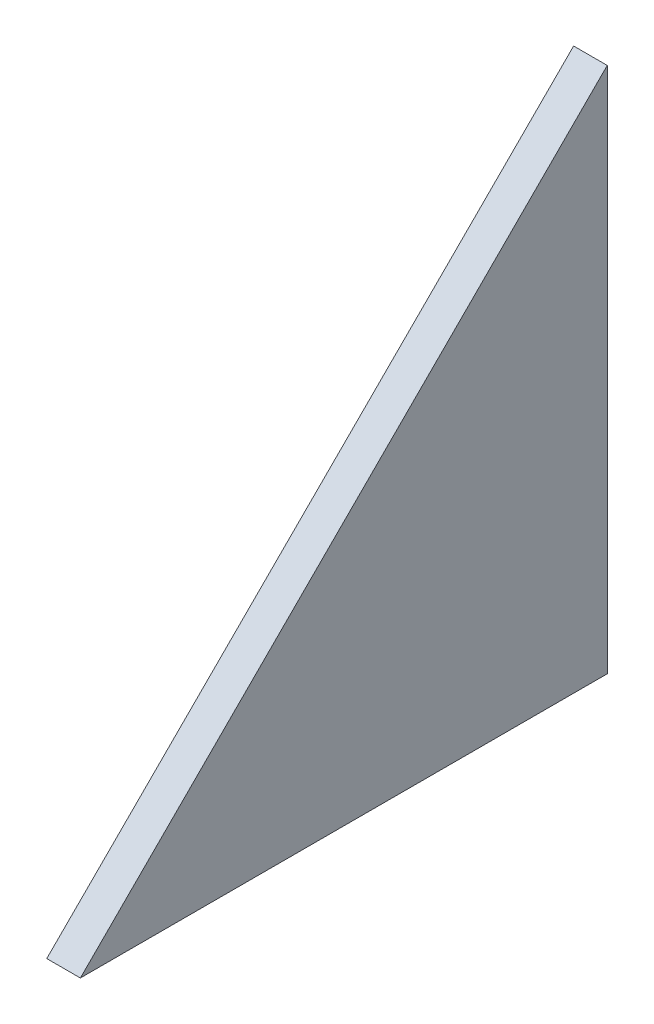
ISO-10303-21;
HEADER;
FILE_DESCRIPTION(('STEP AP214'),'2;1');
FILE_NAME('part.step','',(''),(''),'','','');
FILE_SCHEMA(('AUTOMOTIVE_DESIGN { 1 0 10303 214 1 1 1 1 }'));
ENDSEC;
DATA;
#1=APPLICATION_CONTEXT('core data for automotive mechanical design processes');
#2=APPLICATION_PROTOCOL_DEFINITION('international standard','automotive_design',2000,#1);
#3=PRODUCT_CONTEXT('',#1,'mechanical');
#4=PRODUCT('Part','Part','',(#3));
#5=PRODUCT_RELATED_PRODUCT_CATEGORY('part','',(#4));
#6=PRODUCT_DEFINITION_FORMATION('','',#4);
#7=PRODUCT_DEFINITION_CONTEXT('part definition',#1,'design');
#8=PRODUCT_DEFINITION('design','',#6,#7);
#9=PRODUCT_DEFINITION_SHAPE('','',#8);
#10=(LENGTH_UNIT() NAMED_UNIT(*) SI_UNIT(.MILLI.,.METRE.));
#11=(NAMED_UNIT(*) PLANE_ANGLE_UNIT() SI_UNIT($,.RADIAN.));
#12=(NAMED_UNIT(*) SI_UNIT($,.STERADIAN.) SOLID_ANGLE_UNIT());
#13=UNCERTAINTY_MEASURE_WITH_UNIT(LENGTH_MEASURE(1.E-05),#10,'distance_accuracy_value','');
#14=(GEOMETRIC_REPRESENTATION_CONTEXT(3) GLOBAL_UNCERTAINTY_ASSIGNED_CONTEXT((#13)) GLOBAL_UNIT_ASSIGNED_CONTEXT((#10,
#11,#12)) REPRESENTATION_CONTEXT('',''));
#15=CARTESIAN_POINT('',(0.,0.,0.));
#16=DIRECTION('',(0.,0.,1.));
#17=DIRECTION('',(1.,0.,0.));
#18=AXIS2_PLACEMENT_3D('',#15,#16,#17);
#19=CARTESIAN_POINT('',(226.844609767675,68.6349498736054,146.992206889765));
#20=DIRECTION('',(0.,-0.707106781186546,-0.70710678118655));
#21=DIRECTION('',(0.,0.70710678118655,-0.707106781186546));
#22=AXIS2_PLACEMENT_3D('',#19,#20,#21);
#23=PLANE('',#22);
#24=DIRECTION('',(0.,-0.707106781186549,0.707106781186545));
#25=VECTOR('',#24,1.);
#26=CARTESIAN_POINT('',(223.844609767675,68.6349498736054,146.992206889765));
#27=LINE('',#26,#25);
#28=CARTESIAN_POINT('',(223.844609767675,115.634949873606,99.9922068897643));
#29=VERTEX_POINT('',#28);
#30=CARTESIAN_POINT('',(223.844609767675,68.6349498736054,146.992206889765));
#31=VERTEX_POINT('',#30);
#32=EDGE_CURVE('E84',#29,#31,#27,.T.);
#33=ORIENTED_EDGE('',*,*,#32,.T.);
#34=DIRECTION('',(-1.,0.,0.));
#35=VECTOR('',#34,1.);
#36=CARTESIAN_POINT('',(226.844609767675,68.6349498736054,146.992206889765));
#37=LINE('',#36,#35);
#38=CARTESIAN_POINT('',(226.844609767675,68.6349498736054,146.992206889765));
#39=VERTEX_POINT('',#38);
#40=EDGE_CURVE('E11',#39,#31,#37,.T.);
#41=ORIENTED_EDGE('',*,*,#40,.F.);
#42=DIRECTION('',(0.,-0.707106781186549,0.707106781186545));
#43=VECTOR('',#42,1.);
#44=CARTESIAN_POINT('',(226.844609767675,68.6349498736054,146.992206889765));
#45=LINE('',#44,#43);
#46=CARTESIAN_POINT('',(226.844609767675,115.634949873606,99.9922068897643));
#47=VERTEX_POINT('',#46);
#48=EDGE_CURVE('E77',#47,#39,#45,.T.);
#49=ORIENTED_EDGE('',*,*,#48,.F.);
#50=DIRECTION('',(-1.,0.,0.));
#51=VECTOR('',#50,1.);
#52=CARTESIAN_POINT('',(226.844609767675,115.634949873606,99.9922068897643));
#53=LINE('',#52,#51);
#54=EDGE_CURVE('E85',#47,#29,#53,.T.);
#55=ORIENTED_EDGE('',*,*,#54,.T.);
#56=EDGE_LOOP('',(#33,#41,#49,#55));
#57=FACE_BOUND('',#56,.T.);
#58=ADVANCED_FACE('F37',(#57),#23,.F.);
#59=CARTESIAN_POINT('',(226.844609767675,68.6349498736054,146.992206889765));
#60=DIRECTION('',(0.,1.,0.));
#61=DIRECTION('',(0.,0.,1.));
#62=AXIS2_PLACEMENT_3D('',#59,#60,#61);
#63=PLANE('',#62);
#64=DIRECTION('',(0.,0.,-1.));
#65=VECTOR('',#64,1.);
#66=CARTESIAN_POINT('',(223.844609767675,68.6349498736054,146.992206889765));
#67=LINE('',#66,#65);
#68=CARTESIAN_POINT('',(223.844609767675,68.6349498736056,99.9922068897646));
#69=VERTEX_POINT('',#68);
#70=EDGE_CURVE('E65',#31,#69,#67,.T.);
#71=ORIENTED_EDGE('',*,*,#70,.T.);
#72=DIRECTION('',(-1.,0.,0.));
#73=VECTOR('',#72,1.);
#74=CARTESIAN_POINT('',(226.844609767675,68.6349498736056,99.9922068897646));
#75=LINE('',#74,#73);
#76=CARTESIAN_POINT('',(226.844609767675,68.6349498736056,99.9922068897646));
#77=VERTEX_POINT('',#76);
#78=EDGE_CURVE('E45',#77,#69,#75,.T.);
#79=ORIENTED_EDGE('',*,*,#78,.F.);
#80=DIRECTION('',(0.,0.,-1.));
#81=VECTOR('',#80,1.);
#82=CARTESIAN_POINT('',(226.844609767675,68.6349498736054,146.992206889765));
#83=LINE('',#82,#81);
#84=EDGE_CURVE('E73',#39,#77,#83,.T.);
#85=ORIENTED_EDGE('',*,*,#84,.F.);
#86=ORIENTED_EDGE('',*,*,#40,.T.);
#87=EDGE_LOOP('',(#71,#79,#85,#86));
#88=FACE_BOUND('',#87,.T.);
#89=ADVANCED_FACE('F74',(#88),#63,.F.);
#90=CARTESIAN_POINT('',(226.844609767675,115.634949873606,99.9922068897643));
#91=DIRECTION('',(0.,0.,1.));
#92=DIRECTION('',(0.,-1.,0.));
#93=AXIS2_PLACEMENT_3D('',#90,#91,#92);
#94=PLANE('',#93);
#95=DIRECTION('',(0.,1.,0.));
#96=VECTOR('',#95,1.);
#97=CARTESIAN_POINT('',(223.844609767675,115.634949873606,99.9922068897643));
#98=LINE('',#97,#96);
#99=EDGE_CURVE('E70',#69,#29,#98,.T.);
#100=ORIENTED_EDGE('',*,*,#99,.T.);
#101=ORIENTED_EDGE('',*,*,#54,.F.);
#102=DIRECTION('',(0.,1.,0.));
#103=VECTOR('',#102,1.);
#104=CARTESIAN_POINT('',(226.844609767675,115.634949873606,99.9922068897643));
#105=LINE('',#104,#103);
#106=EDGE_CURVE('E53',#77,#47,#105,.T.);
#107=ORIENTED_EDGE('',*,*,#106,.F.);
#108=ORIENTED_EDGE('',*,*,#78,.T.);
#109=EDGE_LOOP('',(#100,#101,#107,#108));
#110=FACE_BOUND('',#109,.T.);
#111=ADVANCED_FACE('F92',(#110),#94,.F.);
#112=CARTESIAN_POINT('',(226.844609767675,0.,0.));
#113=DIRECTION('',(-1.,0.,0.));
#114=DIRECTION('',(0.,0.,1.));
#115=AXIS2_PLACEMENT_3D('',#112,#113,#114);
#116=PLANE('',#115);
#117=ORIENTED_EDGE('',*,*,#48,.T.);
#118=ORIENTED_EDGE('',*,*,#84,.T.);
#119=ORIENTED_EDGE('',*,*,#106,.T.);
#120=EDGE_LOOP('',(#117,#118,#119));
#121=FACE_BOUND('',#120,.T.);
#122=ADVANCED_FACE('F80',(#121),#116,.F.);
#123=CARTESIAN_POINT('',(223.844609767675,0.,0.));
#124=DIRECTION('',(-1.,0.,0.));
#125=DIRECTION('',(0.,0.,1.));
#126=AXIS2_PLACEMENT_3D('',#123,#124,#125);
#127=PLANE('',#126);
#128=ORIENTED_EDGE('',*,*,#32,.F.);
#129=ORIENTED_EDGE('',*,*,#99,.F.);
#130=ORIENTED_EDGE('',*,*,#70,.F.);
#131=EDGE_LOOP('',(#128,#129,#130));
#132=FACE_BOUND('',#131,.T.);
#133=ADVANCED_FACE('F93',(#132),#127,.T.);
#134=CLOSED_SHELL('',(#58,#89,#111,#122,#133));
#135=MANIFOLD_SOLID_BREP('B2',#134);
#136=ADVANCED_BREP_SHAPE_REPRESENTATION('',(#18,#135),#14);
#137=SHAPE_DEFINITION_REPRESENTATION(#9,#136);
ENDSEC;
END-ISO-10303-21;
